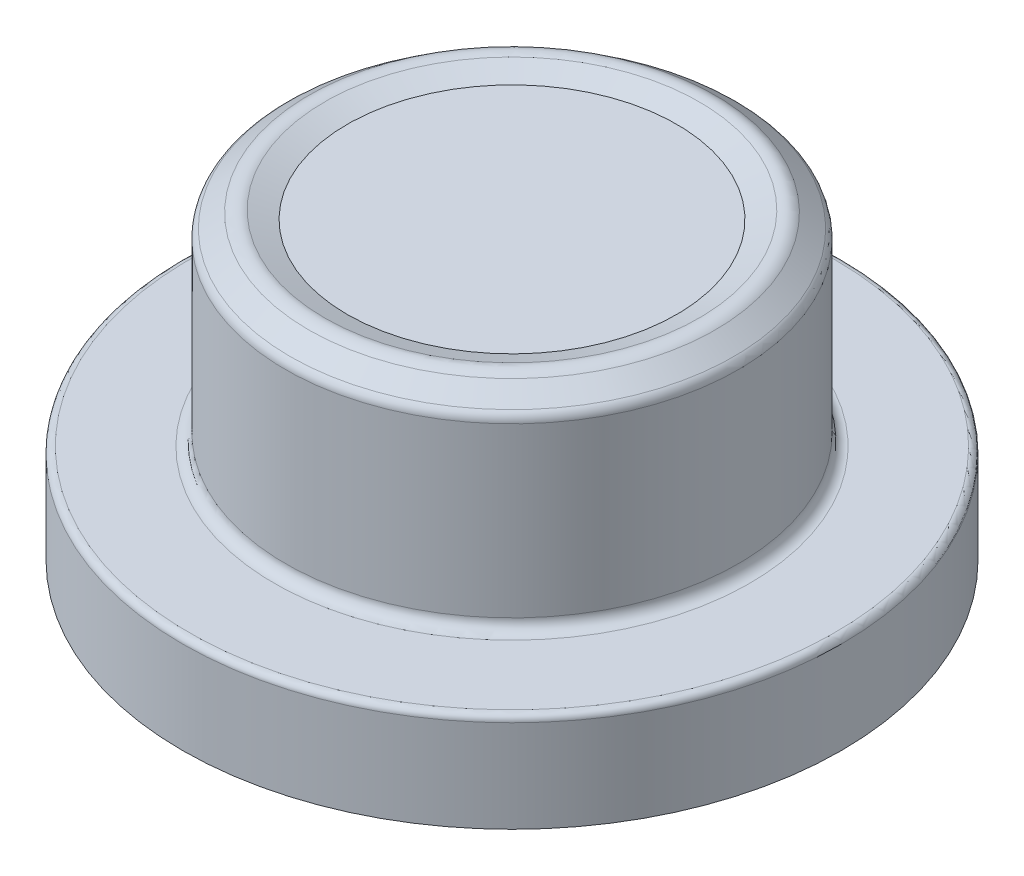
ISO-10303-21;
HEADER;
FILE_DESCRIPTION(('STEP AP214'),'2;1');
FILE_NAME('part.step','',(''),(''),'','','');
FILE_SCHEMA(('AUTOMOTIVE_DESIGN { 1 0 10303 214 1 1 1 1 }'));
ENDSEC;
DATA;
#1=APPLICATION_CONTEXT('core data for automotive mechanical design processes');
#2=APPLICATION_PROTOCOL_DEFINITION('international standard','automotive_design',2000,#1);
#3=PRODUCT_CONTEXT('',#1,'mechanical');
#4=PRODUCT('Part','Part','',(#3));
#5=PRODUCT_RELATED_PRODUCT_CATEGORY('part','',(#4));
#6=PRODUCT_DEFINITION_FORMATION('','',#4);
#7=PRODUCT_DEFINITION_CONTEXT('part definition',#1,'design');
#8=PRODUCT_DEFINITION('design','',#6,#7);
#9=PRODUCT_DEFINITION_SHAPE('','',#8);
#10=(LENGTH_UNIT() NAMED_UNIT(*) SI_UNIT(.MILLI.,.METRE.));
#11=(NAMED_UNIT(*) PLANE_ANGLE_UNIT() SI_UNIT($,.RADIAN.));
#12=(NAMED_UNIT(*) SI_UNIT($,.STERADIAN.) SOLID_ANGLE_UNIT());
#13=UNCERTAINTY_MEASURE_WITH_UNIT(LENGTH_MEASURE(1.E-05),#10,'distance_accuracy_value','');
#14=(GEOMETRIC_REPRESENTATION_CONTEXT(3) GLOBAL_UNCERTAINTY_ASSIGNED_CONTEXT((#13)) GLOBAL_UNIT_ASSIGNED_CONTEXT((#10,
#11,#12)) REPRESENTATION_CONTEXT('',''));
#15=CARTESIAN_POINT('',(0.,0.,0.));
#16=DIRECTION('',(0.,0.,1.));
#17=DIRECTION('',(1.,0.,0.));
#18=AXIS2_PLACEMENT_3D('',#15,#16,#17);
#19=CARTESIAN_POINT('',(0.,4.34594,-2.794));
#20=DIRECTION('',(0.,-1.,0.));
#21=DIRECTION('',(0.,0.,-1.));
#22=AXIS2_PLACEMENT_3D('',#19,#20,#21);
#23=PLANE('',#22);
#24=CARTESIAN_POINT('',(0.,4.34594,0.));
#25=DIRECTION('',(0.,-1.,0.));
#26=DIRECTION('',(0.,0.,-1.));
#27=AXIS2_PLACEMENT_3D('',#24,#25,#26);
#28=CIRCLE('',#27,2.921);
#29=CARTESIAN_POINT('',(0.,4.34594,-2.921));
#30=VERTEX_POINT('',#29);
#31=EDGE_CURVE('E11',#30,#30,#28,.T.);
#32=ORIENTED_EDGE('',*,*,#31,.T.);
#33=EDGE_LOOP('',(#32));
#34=FACE_BOUND('',#33,.T.);
#35=CARTESIAN_POINT('',(0.,4.34594,0.));
#36=DIRECTION('',(0.,-1.,0.));
#37=DIRECTION('',(0.,0.,-1.));
#38=AXIS2_PLACEMENT_3D('',#35,#36,#37);
#39=CIRCLE('',#38,2.794);
#40=CARTESIAN_POINT('',(0.,4.34594,-2.794));
#41=VERTEX_POINT('',#40);
#42=EDGE_CURVE('E55',#41,#41,#39,.T.);
#43=ORIENTED_EDGE('',*,*,#42,.F.);
#44=EDGE_LOOP('',(#43));
#45=FACE_BOUND('',#44,.T.);
#46=ADVANCED_FACE('F41',(#34,#45),#23,.T.);
#47=CARTESIAN_POINT('',(0.,-5.9309,0.));
#48=DIRECTION('',(0.,-1.,0.));
#49=DIRECTION('',(0.,0.,-1.));
#50=AXIS2_PLACEMENT_3D('',#47,#48,#49);
#51=CYLINDRICAL_SURFACE('',#50,2.921);
#52=CARTESIAN_POINT('',(0.,4.47294,0.));
#53=DIRECTION('',(0.,-1.,0.));
#54=DIRECTION('',(0.,0.,-1.));
#55=AXIS2_PLACEMENT_3D('',#52,#53,#54);
#56=CIRCLE('',#55,2.921);
#57=CARTESIAN_POINT('',(0.,4.47294,-2.921));
#58=VERTEX_POINT('',#57);
#59=EDGE_CURVE('E47',#58,#58,#56,.T.);
#60=ORIENTED_EDGE('',*,*,#59,.T.);
#61=EDGE_LOOP('',(#60));
#62=FACE_BOUND('',#61,.T.);
#63=ORIENTED_EDGE('',*,*,#31,.F.);
#64=EDGE_LOOP('',(#63));
#65=FACE_BOUND('',#64,.T.);
#66=ADVANCED_FACE('F65',(#62,#65),#51,.T.);
#67=CARTESIAN_POINT('',(0.,4.47294,-2.794));
#68=DIRECTION('',(0.,1.,0.));
#69=DIRECTION('',(0.,0.,1.));
#70=AXIS2_PLACEMENT_3D('',#67,#68,#69);
#71=PLANE('',#70);
#72=CARTESIAN_POINT('',(0.,4.47294,0.));
#73=DIRECTION('',(0.,-1.,0.));
#74=DIRECTION('',(0.,0.,-1.));
#75=AXIS2_PLACEMENT_3D('',#72,#73,#74);
#76=CIRCLE('',#75,2.794);
#77=CARTESIAN_POINT('',(0.,4.47294,-2.794));
#78=VERTEX_POINT('',#77);
#79=EDGE_CURVE('E51',#78,#78,#76,.T.);
#80=ORIENTED_EDGE('',*,*,#79,.T.);
#81=EDGE_LOOP('',(#80));
#82=FACE_BOUND('',#81,.T.);
#83=ORIENTED_EDGE('',*,*,#59,.F.);
#84=EDGE_LOOP('',(#83));
#85=FACE_BOUND('',#84,.T.);
#86=ADVANCED_FACE('F69',(#82,#85),#71,.T.);
#87=CARTESIAN_POINT('',(0.,-5.9309,0.));
#88=DIRECTION('',(0.,-1.,0.));
#89=DIRECTION('',(0.,0.,-1.));
#90=AXIS2_PLACEMENT_3D('',#87,#88,#89);
#91=CYLINDRICAL_SURFACE('',#90,2.794);
#92=ORIENTED_EDGE('',*,*,#42,.T.);
#93=EDGE_LOOP('',(#92));
#94=FACE_BOUND('',#93,.T.);
#95=ORIENTED_EDGE('',*,*,#79,.F.);
#96=EDGE_LOOP('',(#95));
#97=FACE_BOUND('',#96,.T.);
#98=ADVANCED_FACE('F61',(#94,#97),#91,.F.);
#99=CLOSED_SHELL('',(#46,#66,#86,#98));
#100=MANIFOLD_SOLID_BREP('B2',#99);
#101=CARTESIAN_POINT('',(0.,-5.6769,0.));
#102=DIRECTION('',(0.,1.,0.));
#103=DIRECTION('',(0.,0.,1.));
#104=AXIS2_PLACEMENT_3D('',#101,#102,#103);
#105=PLANE('',#104);
#106=CARTESIAN_POINT('',(0.,-5.6769,0.));
#107=DIRECTION('',(0.,-1.,0.));
#108=DIRECTION('',(0.,0.,-1.));
#109=AXIS2_PLACEMENT_3D('',#106,#107,#108);
#110=CIRCLE('',#109,11.1125);
#111=CARTESIAN_POINT('',(0.,-5.6769,-11.1125));
#112=VERTEX_POINT('',#111);
#113=EDGE_CURVE('E40',#112,#112,#110,.T.);
#114=ORIENTED_EDGE('',*,*,#113,.F.);
#115=EDGE_LOOP('',(#114));
#116=FACE_BOUND('',#115,.T.);
#117=ADVANCED_FACE('F110',(#116),#105,.T.);
#118=CARTESIAN_POINT('',(0.,-5.9309,0.));
#119=DIRECTION('',(0.,-1.,0.));
#120=DIRECTION('',(0.,0.,-1.));
#121=AXIS2_PLACEMENT_3D('',#118,#119,#120);
#122=CYLINDRICAL_SURFACE('',#121,11.1125);
#123=ORIENTED_EDGE('',*,*,#113,.T.);
#124=EDGE_LOOP('',(#123));
#125=FACE_BOUND('',#124,.T.);
#126=CARTESIAN_POINT('',(0.,-5.9309,0.));
#127=DIRECTION('',(0.,-1.,0.));
#128=DIRECTION('',(0.,0.,-1.));
#129=AXIS2_PLACEMENT_3D('',#126,#127,#128);
#130=CIRCLE('',#129,11.1125);
#131=CARTESIAN_POINT('',(0.,-5.9309,-11.1125));
#132=VERTEX_POINT('',#131);
#133=EDGE_CURVE('E116',#132,#132,#130,.T.);
#134=ORIENTED_EDGE('',*,*,#133,.F.);
#135=EDGE_LOOP('',(#134));
#136=FACE_BOUND('',#135,.T.);
#137=ADVANCED_FACE('F124',(#125,#136),#122,.T.);
#138=CARTESIAN_POINT('',(0.,-5.9309,0.));
#139=DIRECTION('',(0.,-1.,0.));
#140=DIRECTION('',(0.,0.,-1.));
#141=AXIS2_PLACEMENT_3D('',#138,#139,#140);
#142=PLANE('',#141);
#143=ORIENTED_EDGE('',*,*,#133,.T.);
#144=EDGE_LOOP('',(#143));
#145=FACE_BOUND('',#144,.T.);
#146=ADVANCED_FACE('F122',(#145),#142,.T.);
#147=CLOSED_SHELL('',(#117,#137,#146));
#148=MANIFOLD_SOLID_BREP('B6',#147);
#149=CARTESIAN_POINT('',(0.,5.57544395893048,0.));
#150=DIRECTION('',(0.,1.,0.));
#151=DIRECTION('',(0.,0.,1.));
#152=AXIS2_PLACEMENT_3D('',#149,#150,#151);
#153=CYLINDRICAL_SURFACE('',#152,6.35);
#154=CARTESIAN_POINT('',(0.,5.57544395893048,0.));
#155=DIRECTION('',(0.,1.,0.));
#156=DIRECTION('',(0.,0.,1.));
#157=AXIS2_PLACEMENT_3D('',#154,#155,#156);
#158=CIRCLE('',#157,6.35);
#159=CARTESIAN_POINT('',(0.,5.57544395893048,6.35));
#160=VERTEX_POINT('',#159);
#161=EDGE_CURVE('E179',#160,#160,#158,.T.);
#162=ORIENTED_EDGE('',*,*,#161,.F.);
#163=EDGE_LOOP('',(#162));
#164=FACE_BOUND('',#163,.T.);
#165=CARTESIAN_POINT('',(0.,4.34594,0.));
#166=DIRECTION('',(0.,1.,0.));
#167=DIRECTION('',(0.,0.,1.));
#168=AXIS2_PLACEMENT_3D('',#165,#166,#167);
#169=CIRCLE('',#168,6.35);
#170=CARTESIAN_POINT('',(0.,4.34594,6.35));
#171=VERTEX_POINT('',#170);
#172=EDGE_CURVE('E109',#171,#171,#169,.T.);
#173=ORIENTED_EDGE('',*,*,#172,.T.);
#174=EDGE_LOOP('',(#173));
#175=FACE_BOUND('',#174,.T.);
#176=ADVANCED_FACE('F157',(#164,#175),#153,.T.);
#177=CARTESIAN_POINT('',(0.,4.34594,-6.35));
#178=DIRECTION('',(0.,1.,0.));
#179=DIRECTION('',(0.,0.,1.));
#180=AXIS2_PLACEMENT_3D('',#177,#178,#179);
#181=PLANE('',#180);
#182=ORIENTED_EDGE('',*,*,#172,.F.);
#183=EDGE_LOOP('',(#182));
#184=FACE_BOUND('',#183,.T.);
#185=CARTESIAN_POINT('',(0.,4.34594,0.));
#186=DIRECTION('',(0.,1.,0.));
#187=DIRECTION('',(0.,0.,1.));
#188=AXIS2_PLACEMENT_3D('',#185,#186,#187);
#189=CIRCLE('',#188,2.921);
#190=CARTESIAN_POINT('',(0.,4.34594,2.921));
#191=VERTEX_POINT('',#190);
#192=EDGE_CURVE('E163',#191,#191,#189,.T.);
#193=ORIENTED_EDGE('',*,*,#192,.T.);
#194=EDGE_LOOP('',(#193));
#195=FACE_BOUND('',#194,.T.);
#196=ADVANCED_FACE('F186',(#184,#195),#181,.F.);
#197=CARTESIAN_POINT('',(0.,5.57544395893048,0.));
#198=DIRECTION('',(0.,1.,0.));
#199=DIRECTION('',(0.,0.,1.));
#200=AXIS2_PLACEMENT_3D('',#197,#198,#199);
#201=CYLINDRICAL_SURFACE('',#200,2.921);
#202=ORIENTED_EDGE('',*,*,#192,.F.);
#203=EDGE_LOOP('',(#202));
#204=FACE_BOUND('',#203,.T.);
#205=CARTESIAN_POINT('',(0.,4.47294,0.));
#206=DIRECTION('',(0.,1.,0.));
#207=DIRECTION('',(0.,0.,1.));
#208=AXIS2_PLACEMENT_3D('',#205,#206,#207);
#209=CIRCLE('',#208,2.921);
#210=CARTESIAN_POINT('',(0.,4.47294,2.921));
#211=VERTEX_POINT('',#210);
#212=EDGE_CURVE('E167',#211,#211,#209,.T.);
#213=ORIENTED_EDGE('',*,*,#212,.T.);
#214=EDGE_LOOP('',(#213));
#215=FACE_BOUND('',#214,.T.);
#216=ADVANCED_FACE('F190',(#204,#215),#201,.F.);
#217=CARTESIAN_POINT('',(0.,4.47294,-2.794));
#218=DIRECTION('',(0.,1.,0.));
#219=DIRECTION('',(0.,0.,1.));
#220=AXIS2_PLACEMENT_3D('',#217,#218,#219);
#221=PLANE('',#220);
#222=ORIENTED_EDGE('',*,*,#212,.F.);
#223=EDGE_LOOP('',(#222));
#224=FACE_BOUND('',#223,.T.);
#225=CARTESIAN_POINT('',(0.,4.47294,0.));
#226=DIRECTION('',(0.,1.,0.));
#227=DIRECTION('',(0.,0.,1.));
#228=AXIS2_PLACEMENT_3D('',#225,#226,#227);
#229=CIRCLE('',#228,2.794);
#230=CARTESIAN_POINT('',(0.,4.47294,2.794));
#231=VERTEX_POINT('',#230);
#232=EDGE_CURVE('E171',#231,#231,#229,.T.);
#233=ORIENTED_EDGE('',*,*,#232,.T.);
#234=EDGE_LOOP('',(#233));
#235=FACE_BOUND('',#234,.T.);
#236=ADVANCED_FACE('F195',(#224,#235),#221,.F.);
#237=CARTESIAN_POINT('',(0.,5.57544395893048,0.));
#238=DIRECTION('',(0.,1.,0.));
#239=DIRECTION('',(0.,0.,1.));
#240=AXIS2_PLACEMENT_3D('',#237,#238,#239);
#241=CYLINDRICAL_SURFACE('',#240,2.794);
#242=ORIENTED_EDGE('',*,*,#232,.F.);
#243=EDGE_LOOP('',(#242));
#244=FACE_BOUND('',#243,.T.);
#245=CARTESIAN_POINT('',(0.,4.34594,0.));
#246=DIRECTION('',(0.,1.,0.));
#247=DIRECTION('',(0.,0.,1.));
#248=AXIS2_PLACEMENT_3D('',#245,#246,#247);
#249=CIRCLE('',#248,2.794);
#250=CARTESIAN_POINT('',(0.,4.34594,2.794));
#251=VERTEX_POINT('',#250);
#252=EDGE_CURVE('E176',#251,#251,#249,.T.);
#253=ORIENTED_EDGE('',*,*,#252,.T.);
#254=EDGE_LOOP('',(#253));
#255=FACE_BOUND('',#254,.T.);
#256=ADVANCED_FACE('F201',(#244,#255),#241,.T.);
#257=CARTESIAN_POINT('',(0.,4.34594,-2.794));
#258=DIRECTION('',(0.,1.,0.));
#259=DIRECTION('',(0.,0.,1.));
#260=AXIS2_PLACEMENT_3D('',#257,#258,#259);
#261=PLANE('',#260);
#262=ORIENTED_EDGE('',*,*,#252,.F.);
#263=EDGE_LOOP('',(#262));
#264=FACE_BOUND('',#263,.T.);
#265=ADVANCED_FACE('F205',(#264),#261,.F.);
#266=CARTESIAN_POINT('',(0.,5.57544395893048,-6.35));
#267=DIRECTION('',(0.,-1.,0.));
#268=DIRECTION('',(0.,0.,-1.));
#269=AXIS2_PLACEMENT_3D('',#266,#267,#268);
#270=PLANE('',#269);
#271=ORIENTED_EDGE('',*,*,#161,.T.);
#272=EDGE_LOOP('',(#271));
#273=FACE_BOUND('',#272,.T.);
#274=ADVANCED_FACE('F183',(#273),#270,.F.);
#275=CLOSED_SHELL('',(#176,#196,#216,#236,#256,#265,#274));
#276=MANIFOLD_SOLID_BREP('B35',#275);
#277=CARTESIAN_POINT('',(0.,-5.8039,-11.1125));
#278=DIRECTION('',(0.,1.,0.));
#279=DIRECTION('',(0.,0.,1.));
#280=AXIS2_PLACEMENT_3D('',#277,#278,#279);
#281=PLANE('',#280);
#282=CARTESIAN_POINT('',(0.,-5.8039,0.));
#283=DIRECTION('',(0.,1.,0.));
#284=DIRECTION('',(0.,0.,1.));
#285=AXIS2_PLACEMENT_3D('',#282,#283,#284);
#286=CIRCLE('',#285,12.7);
#287=CARTESIAN_POINT('',(0.,-5.8039,12.7));
#288=VERTEX_POINT('',#287);
#289=EDGE_CURVE('E283',#288,#288,#286,.T.);
#290=ORIENTED_EDGE('',*,*,#289,.F.);
#291=EDGE_LOOP('',(#290));
#292=FACE_BOUND('',#291,.T.);
#293=CARTESIAN_POINT('',(0.,-5.8039,0.));
#294=DIRECTION('',(0.,1.,0.));
#295=DIRECTION('',(0.,0.,1.));
#296=AXIS2_PLACEMENT_3D('',#293,#294,#295);
#297=CIRCLE('',#296,11.1125);
#298=CARTESIAN_POINT('',(0.,-5.8039,11.1125));
#299=VERTEX_POINT('',#298);
#300=EDGE_CURVE('E307',#299,#299,#297,.T.);
#301=ORIENTED_EDGE('',*,*,#300,.T.);
#302=EDGE_LOOP('',(#301));
#303=FACE_BOUND('',#302,.T.);
#304=ADVANCED_FACE('F257',(#292,#303),#281,.F.);
#305=CARTESIAN_POINT('',(0.,-0.0127000000000017,0.));
#306=DIRECTION('',(0.,1.,0.));
#307=DIRECTION('',(0.,0.,1.));
#308=AXIS2_PLACEMENT_3D('',#305,#306,#307);
#309=CYLINDRICAL_SURFACE('',#308,12.7);
#310=CARTESIAN_POINT('',(0.,-2.2479,0.));
#311=DIRECTION('',(0.,-1.,0.));
#312=DIRECTION('',(0.,0.,-1.));
#313=AXIS2_PLACEMENT_3D('',#310,#311,#312);
#314=CIRCLE('',#313,12.7);
#315=CARTESIAN_POINT('',(0.,-2.2479,-12.7));
#316=VERTEX_POINT('',#315);
#317=EDGE_CURVE('E156',#316,#316,#314,.T.);
#318=ORIENTED_EDGE('',*,*,#317,.T.);
#319=EDGE_LOOP('',(#318));
#320=FACE_BOUND('',#319,.T.);
#321=ORIENTED_EDGE('',*,*,#289,.T.);
#322=EDGE_LOOP('',(#321));
#323=FACE_BOUND('',#322,.T.);
#324=ADVANCED_FACE('F330',(#320,#323),#309,.T.);
#325=CARTESIAN_POINT('',(0.,-1.9939,-12.7));
#326=DIRECTION('',(0.,-1.,0.));
#327=DIRECTION('',(0.,0.,-1.));
#328=AXIS2_PLACEMENT_3D('',#325,#326,#327);
#329=PLANE('',#328);
#330=CARTESIAN_POINT('',(0.,-1.9939,0.));
#331=DIRECTION('',(0.,-1.,0.));
#332=DIRECTION('',(0.,0.,-1.));
#333=AXIS2_PLACEMENT_3D('',#330,#331,#332);
#334=CIRCLE('',#333,12.446);
#335=CARTESIAN_POINT('',(0.,-1.9939,-12.446));
#336=VERTEX_POINT('',#335);
#337=EDGE_CURVE('E264',#336,#336,#334,.F.);
#338=ORIENTED_EDGE('',*,*,#337,.T.);
#339=EDGE_LOOP('',(#338));
#340=FACE_BOUND('',#339,.T.);
#341=CARTESIAN_POINT('',(0.,-1.9939,0.));
#342=DIRECTION('',(0.,-1.,0.));
#343=DIRECTION('',(0.,0.,-1.));
#344=AXIS2_PLACEMENT_3D('',#341,#342,#343);
#345=CIRCLE('',#344,9.161145);
#346=CARTESIAN_POINT('',(0.,-1.9939,-9.161145));
#347=VERTEX_POINT('',#346);
#348=EDGE_CURVE('E268',#347,#347,#345,.T.);
#349=ORIENTED_EDGE('',*,*,#348,.T.);
#350=EDGE_LOOP('',(#349));
#351=FACE_BOUND('',#350,.T.);
#352=ADVANCED_FACE('F336',(#340,#351),#329,.F.);
#353=CARTESIAN_POINT('',(0.,-0.0127000000000017,0.));
#354=DIRECTION('',(0.,1.,0.));
#355=DIRECTION('',(0.,0.,1.));
#356=AXIS2_PLACEMENT_3D('',#353,#354,#355);
#357=CYLINDRICAL_SURFACE('',#356,8.7249);
#358=CARTESIAN_POINT('',(0.,4.91925939230068,0.));
#359=DIRECTION('',(0.,-1.,0.));
#360=DIRECTION('',(0.,0.,-1.));
#361=AXIS2_PLACEMENT_3D('',#358,#359,#360);
#362=CIRCLE('',#361,8.7249);
#363=CARTESIAN_POINT('',(0.,4.91925939230068,-8.7249));
#364=VERTEX_POINT('',#363);
#365=EDGE_CURVE('E272',#364,#364,#362,.T.);
#366=ORIENTED_EDGE('',*,*,#365,.T.);
#367=EDGE_LOOP('',(#366));
#368=FACE_BOUND('',#367,.T.);
#369=CARTESIAN_POINT('',(0.,-1.557655,0.));
#370=DIRECTION('',(0.,-1.,0.));
#371=DIRECTION('',(0.,0.,-1.));
#372=AXIS2_PLACEMENT_3D('',#369,#370,#371);
#373=CIRCLE('',#372,8.7249);
#374=CARTESIAN_POINT('',(0.,-1.557655,-8.7249));
#375=VERTEX_POINT('',#374);
#376=EDGE_CURVE('E277',#375,#375,#373,.F.);
#377=ORIENTED_EDGE('',*,*,#376,.T.);
#378=EDGE_LOOP('',(#377));
#379=FACE_BOUND('',#378,.T.);
#380=ADVANCED_FACE('F354',(#368,#379),#357,.T.);
#381=CARTESIAN_POINT('',(0.,5.13842,0.));
#382=DIRECTION('',(0.,-1.,0.));
#383=DIRECTION('',(0.,0.,-1.));
#384=AXIS2_PLACEMENT_3D('',#381,#382,#383);
#385=CONICAL_SURFACE('',#384,8.7249,0.931099022773232);
#386=CARTESIAN_POINT('',(0.,5.26924849959084,0.));
#387=DIRECTION('',(0.,1.,0.));
#388=DIRECTION('',(0.,0.,1.));
#389=AXIS2_PLACEMENT_3D('',#386,#387,#388);
#390=CIRCLE('',#389,8.54907259695388);
#391=CARTESIAN_POINT('',(0.,5.26924849959084,8.54907259695388));
#392=VERTEX_POINT('',#391);
#393=EDGE_CURVE('E280',#392,#392,#390,.T.);
#394=ORIENTED_EDGE('',*,*,#393,.T.);
#395=EDGE_LOOP('',(#394));
#396=FACE_BOUND('',#395,.T.);
#397=CARTESIAN_POINT('',(0.,5.80108249947853,0.));
#398=DIRECTION('',(0.,1.,0.));
#399=DIRECTION('',(0.,0.,1.));
#400=AXIS2_PLACEMENT_3D('',#397,#398,#399);
#401=CIRCLE('',#400,7.8343125);
#402=CARTESIAN_POINT('',(0.,5.80108249947853,7.8343125));
#403=VERTEX_POINT('',#402);
#404=EDGE_CURVE('E286',#403,#403,#401,.T.);
#405=ORIENTED_EDGE('',*,*,#404,.F.);
#406=EDGE_LOOP('',(#405));
#407=FACE_BOUND('',#406,.T.);
#408=ADVANCED_FACE('F356',(#396,#407),#385,.T.);
#409=CARTESIAN_POINT('',(0.,5.27433922790878,0.));
#410=DIRECTION('',(0.,1.,0.));
#411=DIRECTION('',(0.,0.,1.));
#412=AXIS2_PLACEMENT_3D('',#409,#410,#411);
#413=TOROIDAL_SURFACE('',#412,7.44237682504171,0.656560772091222);
#414=CARTESIAN_POINT('',(0.,5.8913045405404,0.));
#415=DIRECTION('',(0.,1.,0.));
#416=DIRECTION('',(0.,0.,1.));
#417=AXIS2_PLACEMENT_3D('',#414,#415,#416);
#418=CIRCLE('',#417,7.21781981566906);
#419=CARTESIAN_POINT('',(0.,5.8913045405404,7.21781981566906));
#420=VERTEX_POINT('',#419);
#421=EDGE_CURVE('E289',#420,#420,#418,.T.);
#422=ORIENTED_EDGE('',*,*,#421,.F.);
#423=EDGE_LOOP('',(#422));
#424=FACE_BOUND('',#423,.T.);
#425=ORIENTED_EDGE('',*,*,#404,.T.);
#426=EDGE_LOOP('',(#425));
#427=FACE_BOUND('',#426,.T.);
#428=ADVANCED_FACE('F363',(#424,#427),#413,.T.);
#429=CARTESIAN_POINT('',(0.,5.8913045405404,0.));
#430=DIRECTION('',(0.,1.,0.));
#431=DIRECTION('',(0.,0.,1.));
#432=AXIS2_PLACEMENT_3D('',#429,#430,#431);
#433=CONICAL_SURFACE('',#432,7.21781981566906,1.22173047639604);
#434=CARTESIAN_POINT('',(0.,5.57544395893048,0.));
#435=DIRECTION('',(0.,1.,0.));
#436=DIRECTION('',(0.,0.,1.));
#437=AXIS2_PLACEMENT_3D('',#434,#435,#436);
#438=CIRCLE('',#437,6.35);
#439=CARTESIAN_POINT('',(0.,5.57544395893048,6.35));
#440=VERTEX_POINT('',#439);
#441=EDGE_CURVE('E292',#440,#440,#438,.T.);
#442=ORIENTED_EDGE('',*,*,#441,.F.);
#443=EDGE_LOOP('',(#442));
#444=FACE_BOUND('',#443,.T.);
#445=ORIENTED_EDGE('',*,*,#421,.T.);
#446=EDGE_LOOP('',(#445));
#447=FACE_BOUND('',#446,.T.);
#448=ADVANCED_FACE('F369',(#444,#447),#433,.F.);
#449=CARTESIAN_POINT('',(0.,-0.0127000000000017,0.));
#450=DIRECTION('',(0.,1.,0.));
#451=DIRECTION('',(0.,0.,1.));
#452=AXIS2_PLACEMENT_3D('',#449,#450,#451);
#453=CYLINDRICAL_SURFACE('',#452,6.35);
#454=CARTESIAN_POINT('',(0.,4.34594,0.));
#455=DIRECTION('',(0.,1.,0.));
#456=DIRECTION('',(0.,0.,1.));
#457=AXIS2_PLACEMENT_3D('',#454,#455,#456);
#458=CIRCLE('',#457,6.35);
#459=CARTESIAN_POINT('',(0.,4.34594,6.35));
#460=VERTEX_POINT('',#459);
#461=EDGE_CURVE('E295',#460,#460,#458,.T.);
#462=ORIENTED_EDGE('',*,*,#461,.F.);
#463=EDGE_LOOP('',(#462));
#464=FACE_BOUND('',#463,.T.);
#465=ORIENTED_EDGE('',*,*,#441,.T.);
#466=EDGE_LOOP('',(#465));
#467=FACE_BOUND('',#466,.T.);
#468=ADVANCED_FACE('F373',(#464,#467),#453,.F.);
#469=CARTESIAN_POINT('',(0.,4.34594,-6.35));
#470=DIRECTION('',(0.,1.,0.));
#471=DIRECTION('',(0.,0.,1.));
#472=AXIS2_PLACEMENT_3D('',#469,#470,#471);
#473=PLANE('',#472);
#474=CARTESIAN_POINT('',(0.,4.34594,0.));
#475=DIRECTION('',(0.,1.,0.));
#476=DIRECTION('',(0.,0.,1.));
#477=AXIS2_PLACEMENT_3D('',#474,#475,#476);
#478=CIRCLE('',#477,7.53745);
#479=CARTESIAN_POINT('',(0.,4.34594,7.53745));
#480=VERTEX_POINT('',#479);
#481=EDGE_CURVE('E298',#480,#480,#478,.T.);
#482=ORIENTED_EDGE('',*,*,#481,.F.);
#483=EDGE_LOOP('',(#482));
#484=FACE_BOUND('',#483,.T.);
#485=ORIENTED_EDGE('',*,*,#461,.T.);
#486=EDGE_LOOP('',(#485));
#487=FACE_BOUND('',#486,.T.);
#488=ADVANCED_FACE('F377',(#484,#487),#473,.F.);
#489=CARTESIAN_POINT('',(0.,-0.0127000000000017,0.));
#490=DIRECTION('',(0.,1.,0.));
#491=DIRECTION('',(0.,0.,1.));
#492=AXIS2_PLACEMENT_3D('',#489,#490,#491);
#493=CYLINDRICAL_SURFACE('',#492,7.53745);
#494=CARTESIAN_POINT('',(0.,-0.0127000000000019,0.));
#495=DIRECTION('',(0.,1.,0.));
#496=DIRECTION('',(0.,0.,1.));
#497=AXIS2_PLACEMENT_3D('',#494,#495,#496);
#498=CIRCLE('',#497,7.53745);
#499=CARTESIAN_POINT('',(0.,-0.012700000000003,7.53745));
#500=VERTEX_POINT('',#499);
#501=EDGE_CURVE('E301',#500,#500,#498,.T.);
#502=ORIENTED_EDGE('',*,*,#501,.F.);
#503=EDGE_LOOP('',(#502));
#504=FACE_BOUND('',#503,.T.);
#505=ORIENTED_EDGE('',*,*,#481,.T.);
#506=EDGE_LOOP('',(#505));
#507=FACE_BOUND('',#506,.T.);
#508=ADVANCED_FACE('F326',(#504,#507),#493,.F.);
#509=CARTESIAN_POINT('',(0.,-0.0127000000000007,-7.53745));
#510=DIRECTION('',(0.,-1.,0.));
#511=DIRECTION('',(0.,0.,-1.));
#512=AXIS2_PLACEMENT_3D('',#509,#510,#511);
#513=PLANE('',#512);
#514=ORIENTED_EDGE('',*,*,#501,.T.);
#515=EDGE_LOOP('',(#514));
#516=FACE_BOUND('',#515,.T.);
#517=ADVANCED_FACE('F321',(#516),#513,.F.);
#518=CARTESIAN_POINT('',(0.,-5.6769,0.));
#519=DIRECTION('',(0.,1.,0.));
#520=DIRECTION('',(0.,0.,1.));
#521=AXIS2_PLACEMENT_3D('',#518,#519,#520);
#522=PLANE('',#521);
#523=CARTESIAN_POINT('',(0.,-5.6769,0.));
#524=DIRECTION('',(0.,1.,0.));
#525=DIRECTION('',(0.,0.,1.));
#526=AXIS2_PLACEMENT_3D('',#523,#524,#525);
#527=CIRCLE('',#526,11.1125);
#528=CARTESIAN_POINT('',(0.,-5.6769,11.1125));
#529=VERTEX_POINT('',#528);
#530=EDGE_CURVE('E304',#529,#529,#527,.T.);
#531=ORIENTED_EDGE('',*,*,#530,.F.);
#532=EDGE_LOOP('',(#531));
#533=FACE_BOUND('',#532,.T.);
#534=ADVANCED_FACE('F316',(#533),#522,.F.);
#535=CARTESIAN_POINT('',(0.,-0.0127000000000017,0.));
#536=DIRECTION('',(0.,1.,0.));
#537=DIRECTION('',(0.,0.,1.));
#538=AXIS2_PLACEMENT_3D('',#535,#536,#537);
#539=CYLINDRICAL_SURFACE('',#538,11.1125);
#540=ORIENTED_EDGE('',*,*,#300,.F.);
#541=EDGE_LOOP('',(#540));
#542=FACE_BOUND('',#541,.T.);
#543=ORIENTED_EDGE('',*,*,#530,.T.);
#544=EDGE_LOOP('',(#543));
#545=FACE_BOUND('',#544,.T.);
#546=ADVANCED_FACE('F312',(#542,#545),#539,.F.);
#547=CARTESIAN_POINT('',(0.,4.91925939230068,0.));
#548=DIRECTION('',(0.,-1.,0.));
#549=DIRECTION('',(0.,0.,-1.));
#550=AXIS2_PLACEMENT_3D('',#547,#548,#549);
#551=TOROIDAL_SURFACE('',#550,8.288655,0.436245);
#552=ORIENTED_EDGE('',*,*,#365,.F.);
#553=EDGE_LOOP('',(#552));
#554=FACE_BOUND('',#553,.T.);
#555=ORIENTED_EDGE('',*,*,#393,.F.);
#556=EDGE_LOOP('',(#555));
#557=FACE_BOUND('',#556,.T.);
#558=ADVANCED_FACE('F315',(#554,#557),#551,.T.);
#559=CARTESIAN_POINT('',(0.,-1.557655,0.));
#560=DIRECTION('',(0.,-1.,0.));
#561=DIRECTION('',(0.,0.,-1.));
#562=AXIS2_PLACEMENT_3D('',#559,#560,#561);
#563=TOROIDAL_SURFACE('',#562,9.161145,0.436245);
#564=ORIENTED_EDGE('',*,*,#348,.F.);
#565=EDGE_LOOP('',(#564));
#566=FACE_BOUND('',#565,.T.);
#567=ORIENTED_EDGE('',*,*,#376,.F.);
#568=EDGE_LOOP('',(#567));
#569=FACE_BOUND('',#568,.T.);
#570=ADVANCED_FACE('F342',(#566,#569),#563,.F.);
#571=CARTESIAN_POINT('',(0.,-2.2479,0.));
#572=DIRECTION('',(0.,-1.,0.));
#573=DIRECTION('',(0.,0.,-1.));
#574=AXIS2_PLACEMENT_3D('',#571,#572,#573);
#575=TOROIDAL_SURFACE('',#574,12.446,0.254);
#576=ORIENTED_EDGE('',*,*,#317,.F.);
#577=EDGE_LOOP('',(#576));
#578=FACE_BOUND('',#577,.T.);
#579=ORIENTED_EDGE('',*,*,#337,.F.);
#580=EDGE_LOOP('',(#579));
#581=FACE_BOUND('',#580,.T.);
#582=ADVANCED_FACE('F259',(#578,#581),#575,.T.);
#583=CLOSED_SHELL('',(#304,#324,#352,#380,#408,#428,#448,#468,#488,#508,#517,#534,#546,#558,
#570,#582));
#584=MANIFOLD_SOLID_BREP('B104',#583);
#585=ADVANCED_BREP_SHAPE_REPRESENTATION('',(#18,#100,#148,#276,#584),#14);
#586=SHAPE_DEFINITION_REPRESENTATION(#9,#585);
ENDSEC;
END-ISO-10303-21;
